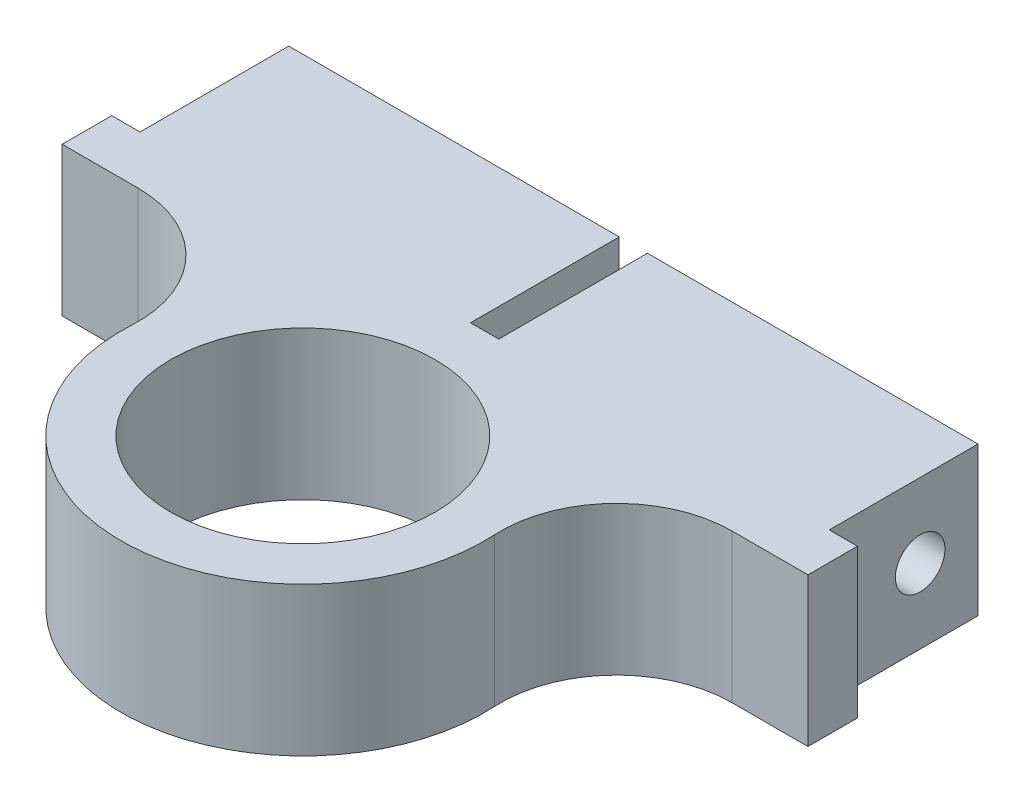
ISO-10303-21;
HEADER;
FILE_DESCRIPTION(('STEP AP214'),'2;1');
FILE_NAME('part.step','',(''),(''),'','','');
FILE_SCHEMA(('AUTOMOTIVE_DESIGN { 1 0 10303 214 1 1 1 1 }'));
ENDSEC;
DATA;
#1=APPLICATION_CONTEXT('core data for automotive mechanical design processes');
#2=APPLICATION_PROTOCOL_DEFINITION('international standard','automotive_design',2000,#1);
#3=PRODUCT_CONTEXT('',#1,'mechanical');
#4=PRODUCT('Part','Part','',(#3));
#5=PRODUCT_RELATED_PRODUCT_CATEGORY('part','',(#4));
#6=PRODUCT_DEFINITION_FORMATION('','',#4);
#7=PRODUCT_DEFINITION_CONTEXT('part definition',#1,'design');
#8=PRODUCT_DEFINITION('design','',#6,#7);
#9=PRODUCT_DEFINITION_SHAPE('','',#8);
#10=(LENGTH_UNIT() NAMED_UNIT(*) SI_UNIT(.MILLI.,.METRE.));
#11=(NAMED_UNIT(*) PLANE_ANGLE_UNIT() SI_UNIT($,.RADIAN.));
#12=(NAMED_UNIT(*) SI_UNIT($,.STERADIAN.) SOLID_ANGLE_UNIT());
#13=UNCERTAINTY_MEASURE_WITH_UNIT(LENGTH_MEASURE(1.E-05),#10,'distance_accuracy_value','');
#14=(GEOMETRIC_REPRESENTATION_CONTEXT(3) GLOBAL_UNCERTAINTY_ASSIGNED_CONTEXT((#13)) GLOBAL_UNIT_ASSIGNED_CONTEXT((#10,
#11,#12)) REPRESENTATION_CONTEXT('',''));
#15=CARTESIAN_POINT('',(0.,0.,0.));
#16=DIRECTION('',(0.,0.,1.));
#17=DIRECTION('',(1.,0.,0.));
#18=AXIS2_PLACEMENT_3D('',#15,#16,#17);
#19=CARTESIAN_POINT('',(0.,10.,0.));
#20=DIRECTION('',(0.,0.,-1.));
#21=DIRECTION('',(-1.,0.,0.));
#22=AXIS2_PLACEMENT_3D('',#19,#20,#21);
#23=PLANE('',#22);
#24=DIRECTION('',(0.,1.,0.));
#25=VECTOR('',#24,1.);
#26=CARTESIAN_POINT('',(4.59279924438858,10.,0.));
#27=LINE('',#26,#25);
#28=CARTESIAN_POINT('',(4.59279924438858,-1.,0.));
#29=VERTEX_POINT('',#28);
#30=CARTESIAN_POINT('',(4.59279924438858,8.,0.));
#31=VERTEX_POINT('',#30);
#32=EDGE_CURVE('E11',#29,#31,#27,.T.);
#33=ORIENTED_EDGE('',*,*,#32,.T.);
#34=DIRECTION('',(1.,0.,0.));
#35=VECTOR('',#34,1.);
#36=CARTESIAN_POINT('',(0.,8.,0.));
#37=LINE('',#36,#35);
#38=CARTESIAN_POINT('',(0.,8.,0.));
#39=VERTEX_POINT('',#38);
#40=EDGE_CURVE('E247',#39,#31,#37,.T.);
#41=ORIENTED_EDGE('',*,*,#40,.F.);
#42=DIRECTION('',(0.,-1.,0.));
#43=VECTOR('',#42,1.);
#44=CARTESIAN_POINT('',(0.,10.,0.));
#45=LINE('',#44,#43);
#46=CARTESIAN_POINT('',(0.,-1.,0.));
#47=VERTEX_POINT('',#46);
#48=EDGE_CURVE('E166',#39,#47,#45,.T.);
#49=ORIENTED_EDGE('',*,*,#48,.T.);
#50=DIRECTION('',(-1.,0.,0.));
#51=VECTOR('',#50,1.);
#52=CARTESIAN_POINT('',(4.59279924438858,-1.,0.));
#53=LINE('',#52,#51);
#54=EDGE_CURVE('E223',#29,#47,#53,.T.);
#55=ORIENTED_EDGE('',*,*,#54,.F.);
#56=EDGE_LOOP('',(#33,#41,#49,#55));
#57=FACE_BOUND('',#56,.T.);
#58=ADVANCED_FACE('F42',(#57),#23,.F.);
#59=CARTESIAN_POINT('',(22.565,10.,8.));
#60=DIRECTION('',(0.,-1.,0.));
#61=DIRECTION('',(0.,0.,-1.));
#62=AXIS2_PLACEMENT_3D('',#59,#60,#61);
#63=CYLINDRICAL_SURFACE('',#62,11.);
#64=DIRECTION('',(0.,-1.,0.));
#65=VECTOR('',#64,1.);
#66=CARTESIAN_POINT('',(33.5480115728736,10.,7.38888888888889));
#67=LINE('',#66,#65);
#68=CARTESIAN_POINT('',(33.5480115728736,-1.,7.38888888888889));
#69=VERTEX_POINT('',#68);
#70=CARTESIAN_POINT('',(33.5480115728736,8.,7.38888888888889));
#71=VERTEX_POINT('',#70);
#72=EDGE_CURVE('E50',#69,#71,#67,.F.);
#73=ORIENTED_EDGE('',*,*,#72,.T.);
#74=CARTESIAN_POINT('',(22.565,8.,8.));
#75=DIRECTION('',(0.,1.,0.));
#76=DIRECTION('',(0.,0.,1.));
#77=AXIS2_PLACEMENT_3D('',#74,#75,#76);
#78=CIRCLE('',#77,11.);
#79=CARTESIAN_POINT('',(11.5819884271264,8.,7.38888888888889));
#80=VERTEX_POINT('',#79);
#81=EDGE_CURVE('E253',#80,#71,#78,.T.);
#82=ORIENTED_EDGE('',*,*,#81,.F.);
#83=DIRECTION('',(0.,-1.,0.));
#84=VECTOR('',#83,1.);
#85=CARTESIAN_POINT('',(11.5819884271264,10.,7.38888888888889));
#86=LINE('',#85,#84);
#87=CARTESIAN_POINT('',(11.5819884271264,-1.,7.3888888888889));
#88=VERTEX_POINT('',#87);
#89=EDGE_CURVE('E303',#80,#88,#86,.T.);
#90=ORIENTED_EDGE('',*,*,#89,.T.);
#91=CARTESIAN_POINT('',(22.565,-1.,8.));
#92=DIRECTION('',(0.,-1.,0.));
#93=DIRECTION('',(0.,0.,-1.));
#94=AXIS2_PLACEMENT_3D('',#91,#92,#93);
#95=CIRCLE('',#94,11.);
#96=EDGE_CURVE('E217',#69,#88,#95,.T.);
#97=ORIENTED_EDGE('',*,*,#96,.F.);
#98=EDGE_LOOP('',(#73,#82,#90,#97));
#99=FACE_BOUND('',#98,.T.);
#100=ADVANCED_FACE('F307',(#99),#63,.T.);
#101=DIRECTION('',(0.,-1.,0.));
#102=VECTOR('',#101,1.);
#103=CARTESIAN_POINT('',(45.13,10.,0.));
#104=LINE('',#103,#102);
#105=CARTESIAN_POINT('',(45.13,8.,0.));
#106=VERTEX_POINT('',#105);
#107=CARTESIAN_POINT('',(45.13,-1.,0.));
#108=VERTEX_POINT('',#107);
#109=EDGE_CURVE('E299',#106,#108,#104,.T.);
#110=ORIENTED_EDGE('',*,*,#109,.F.);
#111=DIRECTION('',(1.,0.,0.));
#112=VECTOR('',#111,1.);
#113=CARTESIAN_POINT('',(40.5372007556114,8.,0.));
#114=LINE('',#113,#112);
#115=CARTESIAN_POINT('',(40.5372007556114,8.,0.));
#116=VERTEX_POINT('',#115);
#117=EDGE_CURVE('E259',#116,#106,#114,.T.);
#118=ORIENTED_EDGE('',*,*,#117,.F.);
#119=DIRECTION('',(0.,1.,0.));
#120=VECTOR('',#119,1.);
#121=CARTESIAN_POINT('',(40.5372007556114,0.,0.));
#122=LINE('',#121,#120);
#123=CARTESIAN_POINT('',(40.5372007556114,-1.,0.));
#124=VERTEX_POINT('',#123);
#125=EDGE_CURVE('E301',#116,#124,#122,.F.);
#126=ORIENTED_EDGE('',*,*,#125,.T.);
#127=DIRECTION('',(-1.,0.,0.));
#128=VECTOR('',#127,1.);
#129=CARTESIAN_POINT('',(45.13,-1.,0.));
#130=LINE('',#129,#128);
#131=EDGE_CURVE('E211',#108,#124,#130,.T.);
#132=ORIENTED_EDGE('',*,*,#131,.F.);
#133=EDGE_LOOP('',(#110,#118,#126,#132));
#134=FACE_BOUND('',#133,.T.);
#135=ADVANCED_FACE('F319',(#134),#23,.F.);
#136=CARTESIAN_POINT('',(45.13,10.,0.));
#137=DIRECTION('',(1.,0.,0.));
#138=DIRECTION('',(0.,0.,-1.));
#139=AXIS2_PLACEMENT_3D('',#136,#137,#138);
#140=PLANE('',#139);
#141=DIRECTION('',(0.,1.,0.));
#142=VECTOR('',#141,1.);
#143=CARTESIAN_POINT('',(45.13,0.,-3.));
#144=LINE('',#143,#142);
#145=CARTESIAN_POINT('',(45.13,-1.,-3.));
#146=VERTEX_POINT('',#145);
#147=CARTESIAN_POINT('',(45.13,8.,-3.));
#148=VERTEX_POINT('',#147);
#149=EDGE_CURVE('E295',#146,#148,#144,.T.);
#150=ORIENTED_EDGE('',*,*,#149,.T.);
#151=DIRECTION('',(0.,0.,-1.));
#152=VECTOR('',#151,1.);
#153=CARTESIAN_POINT('',(45.13,8.,0.));
#154=LINE('',#153,#152);
#155=EDGE_CURVE('E262',#106,#148,#154,.T.);
#156=ORIENTED_EDGE('',*,*,#155,.F.);
#157=ORIENTED_EDGE('',*,*,#109,.T.);
#158=DIRECTION('',(0.,0.,1.));
#159=VECTOR('',#158,1.);
#160=CARTESIAN_POINT('',(45.13,-1.,-3.));
#161=LINE('',#160,#159);
#162=EDGE_CURVE('E208',#146,#108,#161,.T.);
#163=ORIENTED_EDGE('',*,*,#162,.F.);
#164=EDGE_LOOP('',(#150,#156,#157,#163));
#165=FACE_BOUND('',#164,.T.);
#166=ADVANCED_FACE('F323',(#165),#140,.T.);
#167=CARTESIAN_POINT('',(22.565,10.,8.));
#168=DIRECTION('',(0.,-1.,0.));
#169=DIRECTION('',(0.,0.,-1.));
#170=AXIS2_PLACEMENT_3D('',#167,#168,#169);
#171=CYLINDRICAL_SURFACE('',#170,8.);
#172=CARTESIAN_POINT('',(22.565,8.,8.));
#173=DIRECTION('',(0.,1.,0.));
#174=DIRECTION('',(0.,0.,1.));
#175=AXIS2_PLACEMENT_3D('',#172,#173,#174);
#176=CIRCLE('',#175,8.);
#177=CARTESIAN_POINT('',(22.565,8.,16.));
#178=VERTEX_POINT('',#177);
#179=EDGE_CURVE('E226',#178,#178,#176,.T.);
#180=ORIENTED_EDGE('',*,*,#179,.T.);
#181=EDGE_LOOP('',(#180));
#182=FACE_BOUND('',#181,.T.);
#183=CARTESIAN_POINT('',(22.565,-1.,8.));
#184=DIRECTION('',(0.,-1.,0.));
#185=DIRECTION('',(0.,0.,-1.));
#186=AXIS2_PLACEMENT_3D('',#183,#184,#185);
#187=CIRCLE('',#186,8.);
#188=CARTESIAN_POINT('',(22.565,-1.,0.));
#189=VERTEX_POINT('',#188);
#190=EDGE_CURVE('E184',#189,#189,#187,.T.);
#191=ORIENTED_EDGE('',*,*,#190,.T.);
#192=EDGE_LOOP('',(#191));
#193=FACE_BOUND('',#192,.T.);
#194=ADVANCED_FACE('F371',(#182,#193),#171,.F.);
#195=CARTESIAN_POINT('',(0.,10.,0.));
#196=DIRECTION('',(-1.,0.,0.));
#197=DIRECTION('',(0.,0.,1.));
#198=AXIS2_PLACEMENT_3D('',#195,#196,#197);
#199=PLANE('',#198);
#200=ORIENTED_EDGE('',*,*,#48,.F.);
#201=DIRECTION('',(0.,0.,1.));
#202=VECTOR('',#201,1.);
#203=CARTESIAN_POINT('',(0.,8.,-3.));
#204=LINE('',#203,#202);
#205=CARTESIAN_POINT('',(0.,8.,-3.));
#206=VERTEX_POINT('',#205);
#207=EDGE_CURVE('E244',#206,#39,#204,.T.);
#208=ORIENTED_EDGE('',*,*,#207,.F.);
#209=DIRECTION('',(0.,1.,0.));
#210=VECTOR('',#209,1.);
#211=CARTESIAN_POINT('',(0.,0.,-3.));
#212=LINE('',#211,#210);
#213=CARTESIAN_POINT('',(0.,-1.,-3.));
#214=VERTEX_POINT('',#213);
#215=EDGE_CURVE('E167',#214,#206,#212,.T.);
#216=ORIENTED_EDGE('',*,*,#215,.F.);
#217=DIRECTION('',(0.,0.,-1.));
#218=VECTOR('',#217,1.);
#219=CARTESIAN_POINT('',(0.,-1.,0.));
#220=LINE('',#219,#218);
#221=EDGE_CURVE('E183',#47,#214,#220,.T.);
#222=ORIENTED_EDGE('',*,*,#221,.F.);
#223=EDGE_LOOP('',(#200,#208,#216,#222));
#224=FACE_BOUND('',#223,.T.);
#225=ADVANCED_FACE('F348',(#224),#199,.T.);
#226=CARTESIAN_POINT('',(40.5372007556114,10.,7.));
#227=DIRECTION('',(0.,-1.,0.));
#228=DIRECTION('',(0.,0.,-1.));
#229=AXIS2_PLACEMENT_3D('',#226,#227,#228);
#230=CYLINDRICAL_SURFACE('',#229,7.);
#231=ORIENTED_EDGE('',*,*,#125,.F.);
#232=CARTESIAN_POINT('',(40.5372007556114,8.,7.));
#233=DIRECTION('',(0.,-1.,0.));
#234=DIRECTION('',(0.,0.,1.));
#235=AXIS2_PLACEMENT_3D('',#232,#233,#234);
#236=CIRCLE('',#235,6.99999999999999);
#237=EDGE_CURVE('E256',#71,#116,#236,.T.);
#238=ORIENTED_EDGE('',*,*,#237,.F.);
#239=ORIENTED_EDGE('',*,*,#72,.F.);
#240=CARTESIAN_POINT('',(40.5372007556114,-1.,7.));
#241=DIRECTION('',(0.,1.,0.));
#242=DIRECTION('',(0.,0.,-1.));
#243=AXIS2_PLACEMENT_3D('',#240,#241,#242);
#244=CIRCLE('',#243,7.);
#245=EDGE_CURVE('E214',#124,#69,#244,.T.);
#246=ORIENTED_EDGE('',*,*,#245,.F.);
#247=EDGE_LOOP('',(#231,#238,#239,#246));
#248=FACE_BOUND('',#247,.T.);
#249=ADVANCED_FACE('F316',(#248),#230,.F.);
#250=CARTESIAN_POINT('',(4.59279924438858,10.,7.));
#251=DIRECTION('',(0.,-1.,0.));
#252=DIRECTION('',(0.,0.,-1.));
#253=AXIS2_PLACEMENT_3D('',#250,#251,#252);
#254=CYLINDRICAL_SURFACE('',#253,7.);
#255=ORIENTED_EDGE('',*,*,#89,.F.);
#256=CARTESIAN_POINT('',(4.59279924438858,8.,7.));
#257=DIRECTION('',(0.,-1.,0.));
#258=DIRECTION('',(0.,0.,1.));
#259=AXIS2_PLACEMENT_3D('',#256,#257,#258);
#260=CIRCLE('',#259,7.);
#261=EDGE_CURVE('E250',#31,#80,#260,.T.);
#262=ORIENTED_EDGE('',*,*,#261,.F.);
#263=ORIENTED_EDGE('',*,*,#32,.F.);
#264=CARTESIAN_POINT('',(4.59279924438858,-1.,7.));
#265=DIRECTION('',(0.,1.,0.));
#266=DIRECTION('',(0.,0.,-1.));
#267=AXIS2_PLACEMENT_3D('',#264,#265,#266);
#268=CIRCLE('',#267,7.);
#269=EDGE_CURVE('E220',#88,#29,#268,.T.);
#270=ORIENTED_EDGE('',*,*,#269,.F.);
#271=EDGE_LOOP('',(#255,#262,#263,#270));
#272=FACE_BOUND('',#271,.T.);
#273=ADVANCED_FACE('F44',(#272),#254,.F.);
#274=CARTESIAN_POINT('',(43.42,0.,0.));
#275=DIRECTION('',(1.,0.,0.));
#276=DIRECTION('',(0.,0.,-1.));
#277=AXIS2_PLACEMENT_3D('',#274,#275,#276);
#278=PLANE('',#277);
#279=CARTESIAN_POINT('',(43.42,3.5,-8.5));
#280=DIRECTION('',(1.,0.,0.));
#281=DIRECTION('',(0.,0.,-1.));
#282=AXIS2_PLACEMENT_3D('',#279,#280,#281);
#283=CIRCLE('',#282,1.5);
#284=CARTESIAN_POINT('',(43.42,3.5,-10.));
#285=VERTEX_POINT('',#284);
#286=EDGE_CURVE('E281',#285,#285,#283,.T.);
#287=ORIENTED_EDGE('',*,*,#286,.F.);
#288=EDGE_LOOP('',(#287));
#289=FACE_BOUND('',#288,.T.);
#290=DIRECTION('',(0.,1.,0.));
#291=VECTOR('',#290,1.);
#292=CARTESIAN_POINT('',(43.42,0.,-3.));
#293=LINE('',#292,#291);
#294=CARTESIAN_POINT('',(43.42,-1.,-3.));
#295=VERTEX_POINT('',#294);
#296=CARTESIAN_POINT('',(43.42,8.,-3.));
#297=VERTEX_POINT('',#296);
#298=EDGE_CURVE('E288',#295,#297,#293,.T.);
#299=ORIENTED_EDGE('',*,*,#298,.F.);
#300=DIRECTION('',(0.,0.,1.));
#301=VECTOR('',#300,1.);
#302=CARTESIAN_POINT('',(43.42,-1.,-12.));
#303=LINE('',#302,#301);
#304=CARTESIAN_POINT('',(43.42,-1.,-12.));
#305=VERTEX_POINT('',#304);
#306=EDGE_CURVE('E202',#305,#295,#303,.T.);
#307=ORIENTED_EDGE('',*,*,#306,.F.);
#308=DIRECTION('',(0.,-1.,0.));
#309=VECTOR('',#308,1.);
#310=CARTESIAN_POINT('',(43.42,7.,-12.));
#311=LINE('',#310,#309);
#312=CARTESIAN_POINT('',(43.42,8.,-12.));
#313=VERTEX_POINT('',#312);
#314=EDGE_CURVE('E65',#313,#305,#311,.T.);
#315=ORIENTED_EDGE('',*,*,#314,.F.);
#316=DIRECTION('',(0.,0.,-1.));
#317=VECTOR('',#316,1.);
#318=CARTESIAN_POINT('',(43.42,8.,-3.));
#319=LINE('',#318,#317);
#320=EDGE_CURVE('E268',#297,#313,#319,.T.);
#321=ORIENTED_EDGE('',*,*,#320,.F.);
#322=EDGE_LOOP('',(#299,#307,#315,#321));
#323=FACE_BOUND('',#322,.T.);
#324=ADVANCED_FACE('F328',(#289,#323),#278,.T.);
#325=CARTESIAN_POINT('',(0.,0.,-3.));
#326=DIRECTION('',(0.,0.,1.));
#327=DIRECTION('',(1.,0.,0.));
#328=AXIS2_PLACEMENT_3D('',#325,#326,#327);
#329=PLANE('',#328);
#330=ORIENTED_EDGE('',*,*,#298,.T.);
#331=DIRECTION('',(-1.,0.,0.));
#332=VECTOR('',#331,1.);
#333=CARTESIAN_POINT('',(45.13,8.,-3.));
#334=LINE('',#333,#332);
#335=EDGE_CURVE('E265',#148,#297,#334,.T.);
#336=ORIENTED_EDGE('',*,*,#335,.F.);
#337=ORIENTED_EDGE('',*,*,#149,.F.);
#338=DIRECTION('',(1.,0.,0.));
#339=VECTOR('',#338,1.);
#340=CARTESIAN_POINT('',(43.42,-1.,-3.));
#341=LINE('',#340,#339);
#342=EDGE_CURVE('E205',#295,#146,#341,.T.);
#343=ORIENTED_EDGE('',*,*,#342,.F.);
#344=EDGE_LOOP('',(#330,#336,#337,#343));
#345=FACE_BOUND('',#344,.T.);
#346=ADVANCED_FACE('F327',(#345),#329,.F.);
#347=CARTESIAN_POINT('',(23.42,0.,0.));
#348=DIRECTION('',(-1.,0.,0.));
#349=DIRECTION('',(0.,0.,1.));
#350=AXIS2_PLACEMENT_3D('',#347,#348,#349);
#351=PLANE('',#350);
#352=CARTESIAN_POINT('',(23.42,3.5,-8.5));
#353=DIRECTION('',(-1.,0.,0.));
#354=DIRECTION('',(0.,0.,1.));
#355=AXIS2_PLACEMENT_3D('',#352,#353,#354);
#356=CIRCLE('',#355,1.5);
#357=CARTESIAN_POINT('',(23.42,3.5,-7.));
#358=VERTEX_POINT('',#357);
#359=EDGE_CURVE('E278',#358,#358,#356,.T.);
#360=ORIENTED_EDGE('',*,*,#359,.F.);
#361=EDGE_LOOP('',(#360));
#362=FACE_BOUND('',#361,.T.);
#363=DIRECTION('',(0.,1.,0.));
#364=VECTOR('',#363,1.);
#365=CARTESIAN_POINT('',(23.42,0.,-3.));
#366=LINE('',#365,#364);
#367=CARTESIAN_POINT('',(23.42,-1.,-3.));
#368=VERTEX_POINT('',#367);
#369=CARTESIAN_POINT('',(23.42,8.,-3.));
#370=VERTEX_POINT('',#369);
#371=EDGE_CURVE('E291',#368,#370,#366,.T.);
#372=ORIENTED_EDGE('',*,*,#371,.T.);
#373=DIRECTION('',(0.,0.,1.));
#374=VECTOR('',#373,1.);
#375=CARTESIAN_POINT('',(23.42,8.,-12.));
#376=LINE('',#375,#374);
#377=CARTESIAN_POINT('',(23.42,8.,-12.));
#378=VERTEX_POINT('',#377);
#379=EDGE_CURVE('E229',#378,#370,#376,.T.);
#380=ORIENTED_EDGE('',*,*,#379,.F.);
#381=DIRECTION('',(0.,1.,0.));
#382=VECTOR('',#381,1.);
#383=CARTESIAN_POINT('',(23.42,0.,-12.));
#384=LINE('',#383,#382);
#385=CARTESIAN_POINT('',(23.42,-1.,-12.));
#386=VERTEX_POINT('',#385);
#387=EDGE_CURVE('E57',#386,#378,#384,.T.);
#388=ORIENTED_EDGE('',*,*,#387,.F.);
#389=DIRECTION('',(0.,0.,-1.));
#390=VECTOR('',#389,1.);
#391=CARTESIAN_POINT('',(23.42,-1.,-3.));
#392=LINE('',#391,#390);
#393=EDGE_CURVE('E196',#368,#386,#392,.T.);
#394=ORIENTED_EDGE('',*,*,#393,.F.);
#395=EDGE_LOOP('',(#372,#380,#388,#394));
#396=FACE_BOUND('',#395,.T.);
#397=ADVANCED_FACE('F333',(#362,#396),#351,.T.);
#398=CARTESIAN_POINT('',(0.,0.,-3.));
#399=DIRECTION('',(0.,0.,1.));
#400=DIRECTION('',(1.,0.,0.));
#401=AXIS2_PLACEMENT_3D('',#398,#399,#400);
#402=PLANE('',#401);
#403=DIRECTION('',(0.,1.,0.));
#404=VECTOR('',#403,1.);
#405=CARTESIAN_POINT('',(21.71,0.,-3.));
#406=LINE('',#405,#404);
#407=CARTESIAN_POINT('',(21.71,-1.,-3.));
#408=VERTEX_POINT('',#407);
#409=CARTESIAN_POINT('',(21.71,8.,-3.));
#410=VERTEX_POINT('',#409);
#411=EDGE_CURVE('E293',#408,#410,#406,.T.);
#412=ORIENTED_EDGE('',*,*,#411,.T.);
#413=DIRECTION('',(-1.,0.,0.));
#414=VECTOR('',#413,1.);
#415=CARTESIAN_POINT('',(23.42,8.,-3.));
#416=LINE('',#415,#414);
#417=EDGE_CURVE('E232',#370,#410,#416,.T.);
#418=ORIENTED_EDGE('',*,*,#417,.F.);
#419=ORIENTED_EDGE('',*,*,#371,.F.);
#420=DIRECTION('',(1.,0.,0.));
#421=VECTOR('',#420,1.);
#422=CARTESIAN_POINT('',(21.71,-1.,-3.));
#423=LINE('',#422,#421);
#424=EDGE_CURVE('E193',#408,#368,#423,.T.);
#425=ORIENTED_EDGE('',*,*,#424,.F.);
#426=EDGE_LOOP('',(#412,#418,#419,#425));
#427=FACE_BOUND('',#426,.T.);
#428=ADVANCED_FACE('F337',(#427),#402,.F.);
#429=CARTESIAN_POINT('',(21.71,0.,0.));
#430=DIRECTION('',(1.,0.,0.));
#431=DIRECTION('',(0.,0.,-1.));
#432=AXIS2_PLACEMENT_3D('',#429,#430,#431);
#433=PLANE('',#432);
#434=CARTESIAN_POINT('',(21.71,3.5,-8.5));
#435=DIRECTION('',(1.,0.,0.));
#436=DIRECTION('',(0.,0.,-1.));
#437=AXIS2_PLACEMENT_3D('',#434,#435,#436);
#438=CIRCLE('',#437,1.5);
#439=CARTESIAN_POINT('',(21.71,3.5,-10.));
#440=VERTEX_POINT('',#439);
#441=EDGE_CURVE('E275',#440,#440,#438,.T.);
#442=ORIENTED_EDGE('',*,*,#441,.F.);
#443=EDGE_LOOP('',(#442));
#444=FACE_BOUND('',#443,.T.);
#445=ORIENTED_EDGE('',*,*,#411,.F.);
#446=DIRECTION('',(0.,0.,1.));
#447=VECTOR('',#446,1.);
#448=CARTESIAN_POINT('',(21.71,-1.,-12.));
#449=LINE('',#448,#447);
#450=CARTESIAN_POINT('',(21.71,-1.,-12.));
#451=VERTEX_POINT('',#450);
#452=EDGE_CURVE('E190',#451,#408,#449,.T.);
#453=ORIENTED_EDGE('',*,*,#452,.F.);
#454=DIRECTION('',(0.,-1.,0.));
#455=VECTOR('',#454,1.);
#456=CARTESIAN_POINT('',(21.71,7.,-12.));
#457=LINE('',#456,#455);
#458=CARTESIAN_POINT('',(21.71,8.,-12.));
#459=VERTEX_POINT('',#458);
#460=EDGE_CURVE('E285',#459,#451,#457,.T.);
#461=ORIENTED_EDGE('',*,*,#460,.F.);
#462=DIRECTION('',(0.,0.,-1.));
#463=VECTOR('',#462,1.);
#464=CARTESIAN_POINT('',(21.71,8.,-3.));
#465=LINE('',#464,#463);
#466=EDGE_CURVE('E235',#410,#459,#465,.T.);
#467=ORIENTED_EDGE('',*,*,#466,.F.);
#468=EDGE_LOOP('',(#445,#453,#461,#467));
#469=FACE_BOUND('',#468,.T.);
#470=ADVANCED_FACE('F341',(#444,#469),#433,.T.);
#471=CARTESIAN_POINT('',(1.71,0.,0.));
#472=DIRECTION('',(-1.,0.,0.));
#473=DIRECTION('',(0.,0.,1.));
#474=AXIS2_PLACEMENT_3D('',#471,#472,#473);
#475=PLANE('',#474);
#476=CARTESIAN_POINT('',(1.71,3.5,-8.5));
#477=DIRECTION('',(-1.,0.,0.));
#478=DIRECTION('',(0.,0.,1.));
#479=AXIS2_PLACEMENT_3D('',#476,#477,#478);
#480=CIRCLE('',#479,1.5);
#481=CARTESIAN_POINT('',(1.71,3.5,-7.));
#482=VERTEX_POINT('',#481);
#483=EDGE_CURVE('E272',#482,#482,#480,.T.);
#484=ORIENTED_EDGE('',*,*,#483,.F.);
#485=EDGE_LOOP('',(#484));
#486=FACE_BOUND('',#485,.T.);
#487=DIRECTION('',(0.,1.,0.));
#488=VECTOR('',#487,1.);
#489=CARTESIAN_POINT('',(1.71,0.,-3.));
#490=LINE('',#489,#488);
#491=CARTESIAN_POINT('',(1.71,-1.,-3.));
#492=VERTEX_POINT('',#491);
#493=CARTESIAN_POINT('',(1.71,8.,-3.));
#494=VERTEX_POINT('',#493);
#495=EDGE_CURVE('E156',#492,#494,#490,.T.);
#496=ORIENTED_EDGE('',*,*,#495,.T.);
#497=DIRECTION('',(0.,0.,1.));
#498=VECTOR('',#497,1.);
#499=CARTESIAN_POINT('',(1.71,8.,-12.));
#500=LINE('',#499,#498);
#501=CARTESIAN_POINT('',(1.71,8.,-12.));
#502=VERTEX_POINT('',#501);
#503=EDGE_CURVE('E241',#502,#494,#500,.T.);
#504=ORIENTED_EDGE('',*,*,#503,.F.);
#505=DIRECTION('',(0.,1.,0.));
#506=VECTOR('',#505,1.);
#507=CARTESIAN_POINT('',(1.71,0.,-12.));
#508=LINE('',#507,#506);
#509=CARTESIAN_POINT('',(1.71,-1.,-12.));
#510=VERTEX_POINT('',#509);
#511=EDGE_CURVE('E172',#510,#502,#508,.T.);
#512=ORIENTED_EDGE('',*,*,#511,.F.);
#513=DIRECTION('',(0.,0.,-1.));
#514=VECTOR('',#513,1.);
#515=CARTESIAN_POINT('',(1.71,-1.,-3.));
#516=LINE('',#515,#514);
#517=EDGE_CURVE('E170',#492,#510,#516,.T.);
#518=ORIENTED_EDGE('',*,*,#517,.F.);
#519=EDGE_LOOP('',(#496,#504,#512,#518));
#520=FACE_BOUND('',#519,.T.);
#521=ADVANCED_FACE('F171',(#486,#520),#475,.T.);
#522=CARTESIAN_POINT('',(0.,0.,-3.));
#523=DIRECTION('',(0.,0.,1.));
#524=DIRECTION('',(1.,0.,0.));
#525=AXIS2_PLACEMENT_3D('',#522,#523,#524);
#526=PLANE('',#525);
#527=ORIENTED_EDGE('',*,*,#215,.T.);
#528=DIRECTION('',(-1.,0.,0.));
#529=VECTOR('',#528,1.);
#530=CARTESIAN_POINT('',(1.71,8.,-3.));
#531=LINE('',#530,#529);
#532=EDGE_CURVE('E162',#494,#206,#531,.T.);
#533=ORIENTED_EDGE('',*,*,#532,.F.);
#534=ORIENTED_EDGE('',*,*,#495,.F.);
#535=DIRECTION('',(1.,0.,0.));
#536=VECTOR('',#535,1.);
#537=CARTESIAN_POINT('',(0.,-1.,-3.));
#538=LINE('',#537,#536);
#539=EDGE_CURVE('E160',#214,#492,#538,.T.);
#540=ORIENTED_EDGE('',*,*,#539,.F.);
#541=EDGE_LOOP('',(#527,#533,#534,#540));
#542=FACE_BOUND('',#541,.T.);
#543=ADVANCED_FACE('F158',(#542),#526,.F.);
#544=CARTESIAN_POINT('',(0.,0.,-12.));
#545=DIRECTION('',(0.,0.,-1.));
#546=DIRECTION('',(-1.,0.,0.));
#547=AXIS2_PLACEMENT_3D('',#544,#545,#546);
#548=PLANE('',#547);
#549=ORIENTED_EDGE('',*,*,#314,.T.);
#550=DIRECTION('',(1.,0.,0.));
#551=VECTOR('',#550,1.);
#552=CARTESIAN_POINT('',(23.42,-1.,-12.));
#553=LINE('',#552,#551);
#554=EDGE_CURVE('E199',#386,#305,#553,.T.);
#555=ORIENTED_EDGE('',*,*,#554,.F.);
#556=ORIENTED_EDGE('',*,*,#387,.T.);
#557=DIRECTION('',(-1.,0.,0.));
#558=VECTOR('',#557,1.);
#559=CARTESIAN_POINT('',(43.42,8.,-12.));
#560=LINE('',#559,#558);
#561=EDGE_CURVE('E270',#313,#378,#560,.T.);
#562=ORIENTED_EDGE('',*,*,#561,.F.);
#563=EDGE_LOOP('',(#549,#555,#556,#562));
#564=FACE_BOUND('',#563,.T.);
#565=ADVANCED_FACE('F330',(#564),#548,.T.);
#566=CARTESIAN_POINT('',(0.,0.,-12.));
#567=DIRECTION('',(0.,0.,-1.));
#568=DIRECTION('',(-1.,0.,0.));
#569=AXIS2_PLACEMENT_3D('',#566,#567,#568);
#570=PLANE('',#569);
#571=ORIENTED_EDGE('',*,*,#460,.T.);
#572=DIRECTION('',(1.,0.,0.));
#573=VECTOR('',#572,1.);
#574=CARTESIAN_POINT('',(1.71,-1.,-12.));
#575=LINE('',#574,#573);
#576=EDGE_CURVE('E176',#510,#451,#575,.T.);
#577=ORIENTED_EDGE('',*,*,#576,.F.);
#578=ORIENTED_EDGE('',*,*,#511,.T.);
#579=DIRECTION('',(-1.,0.,0.));
#580=VECTOR('',#579,1.);
#581=CARTESIAN_POINT('',(21.71,8.,-12.));
#582=LINE('',#581,#580);
#583=EDGE_CURVE('E238',#459,#502,#582,.T.);
#584=ORIENTED_EDGE('',*,*,#583,.F.);
#585=EDGE_LOOP('',(#571,#577,#578,#584));
#586=FACE_BOUND('',#585,.T.);
#587=ADVANCED_FACE('F344',(#586),#570,.T.);
#588=CARTESIAN_POINT('',(45.71,3.5,-8.5));
#589=DIRECTION('',(-1.,0.,0.));
#590=DIRECTION('',(0.,0.,1.));
#591=AXIS2_PLACEMENT_3D('',#588,#589,#590);
#592=CYLINDRICAL_SURFACE('',#591,1.5);
#593=ORIENTED_EDGE('',*,*,#441,.T.);
#594=EDGE_LOOP('',(#593));
#595=FACE_BOUND('',#594,.T.);
#596=ORIENTED_EDGE('',*,*,#483,.T.);
#597=EDGE_LOOP('',(#596));
#598=FACE_BOUND('',#597,.T.);
#599=ADVANCED_FACE('F399',(#595,#598),#592,.F.);
#600=ORIENTED_EDGE('',*,*,#286,.T.);
#601=EDGE_LOOP('',(#600));
#602=FACE_BOUND('',#601,.T.);
#603=ORIENTED_EDGE('',*,*,#359,.T.);
#604=EDGE_LOOP('',(#603));
#605=FACE_BOUND('',#604,.T.);
#606=ADVANCED_FACE('F402',(#602,#605),#592,.F.);
#607=CARTESIAN_POINT('',(4.59279924438858,8.,7.));
#608=DIRECTION('',(0.,1.,0.));
#609=DIRECTION('',(0.,0.,1.));
#610=AXIS2_PLACEMENT_3D('',#607,#608,#609);
#611=PLANE('',#610);
#612=ORIENTED_EDGE('',*,*,#379,.T.);
#613=ORIENTED_EDGE('',*,*,#417,.T.);
#614=ORIENTED_EDGE('',*,*,#466,.T.);
#615=ORIENTED_EDGE('',*,*,#583,.T.);
#616=ORIENTED_EDGE('',*,*,#503,.T.);
#617=ORIENTED_EDGE('',*,*,#532,.T.);
#618=ORIENTED_EDGE('',*,*,#207,.T.);
#619=ORIENTED_EDGE('',*,*,#40,.T.);
#620=ORIENTED_EDGE('',*,*,#261,.T.);
#621=ORIENTED_EDGE('',*,*,#81,.T.);
#622=ORIENTED_EDGE('',*,*,#237,.T.);
#623=ORIENTED_EDGE('',*,*,#117,.T.);
#624=ORIENTED_EDGE('',*,*,#155,.T.);
#625=ORIENTED_EDGE('',*,*,#335,.T.);
#626=ORIENTED_EDGE('',*,*,#320,.T.);
#627=ORIENTED_EDGE('',*,*,#561,.T.);
#628=EDGE_LOOP('',(#612,#613,#614,#615,#616,#617,#618,#619,#620,#621,#622,#623,#624,#625,#626,#627));
#629=FACE_BOUND('',#628,.T.);
#630=ORIENTED_EDGE('',*,*,#179,.F.);
#631=EDGE_LOOP('',(#630));
#632=FACE_BOUND('',#631,.T.);
#633=ADVANCED_FACE('F312',(#629,#632),#611,.T.);
#634=CARTESIAN_POINT('',(40.5372007556114,-1.,7.));
#635=DIRECTION('',(0.,-1.,0.));
#636=DIRECTION('',(0.,0.,-1.));
#637=AXIS2_PLACEMENT_3D('',#634,#635,#636);
#638=PLANE('',#637);
#639=ORIENTED_EDGE('',*,*,#539,.T.);
#640=ORIENTED_EDGE('',*,*,#517,.T.);
#641=ORIENTED_EDGE('',*,*,#576,.T.);
#642=ORIENTED_EDGE('',*,*,#452,.T.);
#643=ORIENTED_EDGE('',*,*,#424,.T.);
#644=ORIENTED_EDGE('',*,*,#393,.T.);
#645=ORIENTED_EDGE('',*,*,#554,.T.);
#646=ORIENTED_EDGE('',*,*,#306,.T.);
#647=ORIENTED_EDGE('',*,*,#342,.T.);
#648=ORIENTED_EDGE('',*,*,#162,.T.);
#649=ORIENTED_EDGE('',*,*,#131,.T.);
#650=ORIENTED_EDGE('',*,*,#245,.T.);
#651=ORIENTED_EDGE('',*,*,#96,.T.);
#652=ORIENTED_EDGE('',*,*,#269,.T.);
#653=ORIENTED_EDGE('',*,*,#54,.T.);
#654=ORIENTED_EDGE('',*,*,#221,.T.);
#655=EDGE_LOOP('',(#639,#640,#641,#642,#643,#644,#645,#646,#647,#648,#649,#650,#651,#652,#653,#654));
#656=FACE_BOUND('',#655,.T.);
#657=ORIENTED_EDGE('',*,*,#190,.F.);
#658=EDGE_LOOP('',(#657));
#659=FACE_BOUND('',#658,.T.);
#660=ADVANCED_FACE('F179',(#656,#659),#638,.T.);
#661=CLOSED_SHELL('',(#58,#100,#135,#166,#194,#225,#249,#273,#324,#346,#397,#428,#470,#521,#543,
#565,#587,#599,#606,#633,#660));
#662=MANIFOLD_SOLID_BREP('B2',#661);
#663=ADVANCED_BREP_SHAPE_REPRESENTATION('',(#18,#662),#14);
#664=SHAPE_DEFINITION_REPRESENTATION(#9,#663);
ENDSEC;
END-ISO-10303-21;
